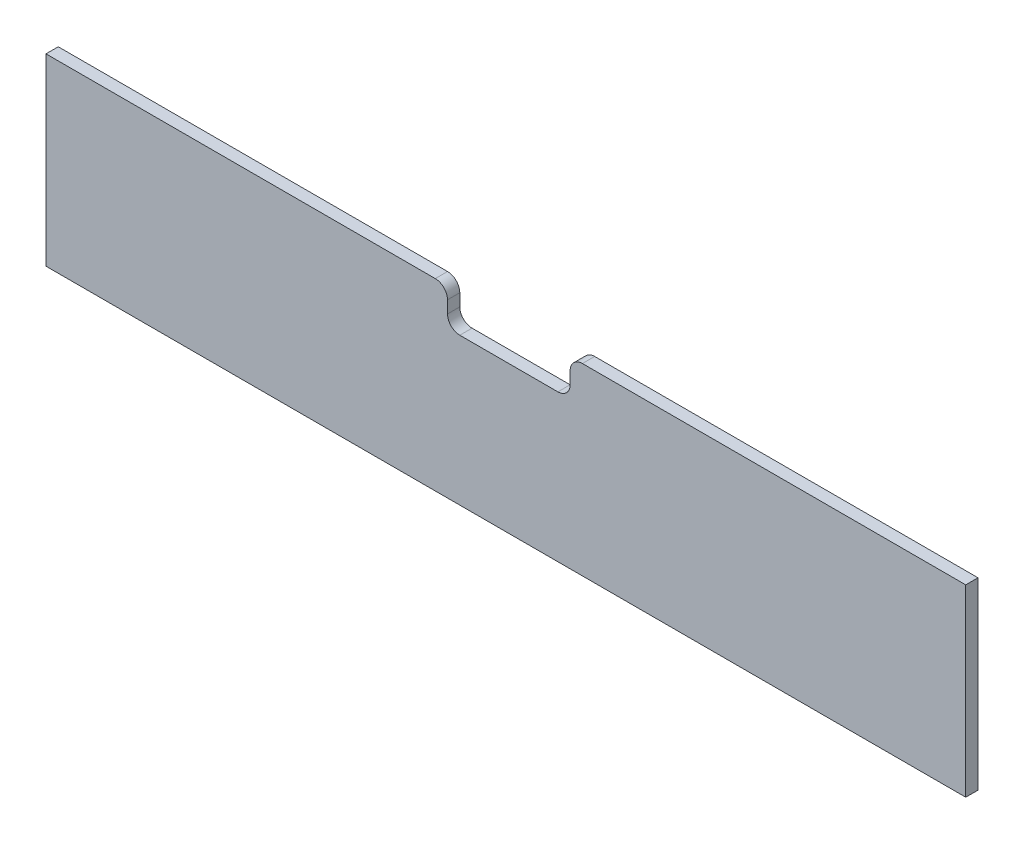
ISO-10303-21;
HEADER;
FILE_DESCRIPTION(('STEP AP214'),'2;1');
FILE_NAME('part.step','',(''),(''),'','','');
FILE_SCHEMA(('AUTOMOTIVE_DESIGN { 1 0 10303 214 1 1 1 1 }'));
ENDSEC;
DATA;
#1=APPLICATION_CONTEXT('core data for automotive mechanical design processes');
#2=APPLICATION_PROTOCOL_DEFINITION('international standard','automotive_design',2000,#1);
#3=PRODUCT_CONTEXT('',#1,'mechanical');
#4=PRODUCT('Part','Part','',(#3));
#5=PRODUCT_RELATED_PRODUCT_CATEGORY('part','',(#4));
#6=PRODUCT_DEFINITION_FORMATION('','',#4);
#7=PRODUCT_DEFINITION_CONTEXT('part definition',#1,'design');
#8=PRODUCT_DEFINITION('design','',#6,#7);
#9=PRODUCT_DEFINITION_SHAPE('','',#8);
#10=(LENGTH_UNIT() NAMED_UNIT(*) SI_UNIT(.MILLI.,.METRE.));
#11=(NAMED_UNIT(*) PLANE_ANGLE_UNIT() SI_UNIT($,.RADIAN.));
#12=(NAMED_UNIT(*) SI_UNIT($,.STERADIAN.) SOLID_ANGLE_UNIT());
#13=UNCERTAINTY_MEASURE_WITH_UNIT(LENGTH_MEASURE(1.E-05),#10,'distance_accuracy_value','');
#14=(GEOMETRIC_REPRESENTATION_CONTEXT(3) GLOBAL_UNCERTAINTY_ASSIGNED_CONTEXT((#13)) GLOBAL_UNIT_ASSIGNED_CONTEXT((#10,
#11,#12)) REPRESENTATION_CONTEXT('',''));
#15=CARTESIAN_POINT('',(0.,0.,0.));
#16=DIRECTION('',(0.,0.,1.));
#17=DIRECTION('',(1.,0.,0.));
#18=AXIS2_PLACEMENT_3D('',#15,#16,#17);
#19=CARTESIAN_POINT('',(-476.25,95.25,12.7));
#20=DIRECTION('',(0.,1.,0.));
#21=DIRECTION('',(0.,0.,1.));
#22=AXIS2_PLACEMENT_3D('',#19,#20,#21);
#23=PLANE('',#22);
#24=DIRECTION('',(1.,0.,0.));
#25=VECTOR('',#24,1.);
#26=CARTESIAN_POINT('',(-476.25,95.25,0.));
#27=LINE('',#26,#25);
#28=CARTESIAN_POINT('',(79.2787632550681,95.25,0.));
#29=VERTEX_POINT('',#28);
#30=CARTESIAN_POINT('',(476.25,95.25,0.));
#31=VERTEX_POINT('',#30);
#32=EDGE_CURVE('E162',#29,#31,#27,.T.);
#33=ORIENTED_EDGE('',*,*,#32,.F.);
#34=DIRECTION('',(0.,0.,1.));
#35=VECTOR('',#34,1.);
#36=CARTESIAN_POINT('',(79.2787632550681,95.25,12.7));
#37=LINE('',#36,#35);
#38=CARTESIAN_POINT('',(79.2787632550681,95.25,12.7));
#39=VERTEX_POINT('',#38);
#40=EDGE_CURVE('E183',#29,#39,#37,.T.);
#41=ORIENTED_EDGE('',*,*,#40,.T.);
#42=DIRECTION('',(1.,0.,0.));
#43=VECTOR('',#42,1.);
#44=CARTESIAN_POINT('',(-476.25,95.25,12.7));
#45=LINE('',#44,#43);
#46=CARTESIAN_POINT('',(476.25,95.25,12.7));
#47=VERTEX_POINT('',#46);
#48=EDGE_CURVE('E144',#39,#47,#45,.T.);
#49=ORIENTED_EDGE('',*,*,#48,.T.);
#50=DIRECTION('',(0.,0.,-1.));
#51=VECTOR('',#50,1.);
#52=CARTESIAN_POINT('',(476.25,95.25,12.7));
#53=LINE('',#52,#51);
#54=EDGE_CURVE('E133',#47,#31,#53,.T.);
#55=ORIENTED_EDGE('',*,*,#54,.T.);
#56=EDGE_LOOP('',(#33,#41,#49,#55));
#57=FACE_BOUND('',#56,.T.);
#58=ADVANCED_FACE('F33',(#57),#23,.T.);
#59=CARTESIAN_POINT('',(-476.25,-95.25,12.7));
#60=DIRECTION('',(-1.,0.,0.));
#61=DIRECTION('',(0.,0.,1.));
#62=AXIS2_PLACEMENT_3D('',#59,#60,#61);
#63=PLANE('',#62);
#64=DIRECTION('',(0.,1.,0.));
#65=VECTOR('',#64,1.);
#66=CARTESIAN_POINT('',(-476.25,-95.25,0.));
#67=LINE('',#66,#65);
#68=CARTESIAN_POINT('',(-476.25,-95.25,0.));
#69=VERTEX_POINT('',#68);
#70=CARTESIAN_POINT('',(-476.25,95.25,0.));
#71=VERTEX_POINT('',#70);
#72=EDGE_CURVE('E160',#69,#71,#67,.T.);
#73=ORIENTED_EDGE('',*,*,#72,.F.);
#74=DIRECTION('',(0.,0.,-1.));
#75=VECTOR('',#74,1.);
#76=CARTESIAN_POINT('',(-476.25,-95.25,12.7));
#77=LINE('',#76,#75);
#78=CARTESIAN_POINT('',(-476.25,-95.25,12.7));
#79=VERTEX_POINT('',#78);
#80=EDGE_CURVE('E147',#79,#69,#77,.T.);
#81=ORIENTED_EDGE('',*,*,#80,.F.);
#82=DIRECTION('',(0.,1.,0.));
#83=VECTOR('',#82,1.);
#84=CARTESIAN_POINT('',(-476.25,-95.25,12.7));
#85=LINE('',#84,#83);
#86=CARTESIAN_POINT('',(-476.25,95.25,12.7));
#87=VERTEX_POINT('',#86);
#88=EDGE_CURVE('E140',#79,#87,#85,.T.);
#89=ORIENTED_EDGE('',*,*,#88,.T.);
#90=DIRECTION('',(0.,0.,-1.));
#91=VECTOR('',#90,1.);
#92=CARTESIAN_POINT('',(-476.25,95.25,12.7));
#93=LINE('',#92,#91);
#94=EDGE_CURVE('E123',#87,#71,#93,.T.);
#95=ORIENTED_EDGE('',*,*,#94,.T.);
#96=EDGE_LOOP('',(#73,#81,#89,#95));
#97=FACE_BOUND('',#96,.T.);
#98=ADVANCED_FACE('F146',(#97),#63,.T.);
#99=CARTESIAN_POINT('',(-476.25,-95.25,12.7));
#100=DIRECTION('',(0.,1.,0.));
#101=DIRECTION('',(0.,0.,1.));
#102=AXIS2_PLACEMENT_3D('',#99,#100,#101);
#103=PLANE('',#102);
#104=DIRECTION('',(1.,0.,0.));
#105=VECTOR('',#104,1.);
#106=CARTESIAN_POINT('',(-476.25,-95.25,0.));
#107=LINE('',#106,#105);
#108=CARTESIAN_POINT('',(476.25,-95.25,0.));
#109=VERTEX_POINT('',#108);
#110=EDGE_CURVE('E149',#69,#109,#107,.T.);
#111=ORIENTED_EDGE('',*,*,#110,.T.);
#112=DIRECTION('',(0.,0.,-1.));
#113=VECTOR('',#112,1.);
#114=CARTESIAN_POINT('',(476.25,-95.25,12.7));
#115=LINE('',#114,#113);
#116=CARTESIAN_POINT('',(476.25,-95.25,12.7));
#117=VERTEX_POINT('',#116);
#118=EDGE_CURVE('E169',#117,#109,#115,.T.);
#119=ORIENTED_EDGE('',*,*,#118,.F.);
#120=DIRECTION('',(1.,0.,0.));
#121=VECTOR('',#120,1.);
#122=CARTESIAN_POINT('',(-476.25,-95.25,12.7));
#123=LINE('',#122,#121);
#124=EDGE_CURVE('E134',#79,#117,#123,.T.);
#125=ORIENTED_EDGE('',*,*,#124,.F.);
#126=ORIENTED_EDGE('',*,*,#80,.T.);
#127=EDGE_LOOP('',(#111,#119,#125,#126));
#128=FACE_BOUND('',#127,.T.);
#129=ADVANCED_FACE('F260',(#128),#103,.F.);
#130=CARTESIAN_POINT('',(476.25,-95.25,12.7));
#131=DIRECTION('',(-1.,0.,0.));
#132=DIRECTION('',(0.,0.,1.));
#133=AXIS2_PLACEMENT_3D('',#130,#131,#132);
#134=PLANE('',#133);
#135=DIRECTION('',(0.,1.,0.));
#136=VECTOR('',#135,1.);
#137=CARTESIAN_POINT('',(476.25,-95.25,0.));
#138=LINE('',#137,#136);
#139=EDGE_CURVE('E151',#109,#31,#138,.T.);
#140=ORIENTED_EDGE('',*,*,#139,.T.);
#141=ORIENTED_EDGE('',*,*,#54,.F.);
#142=DIRECTION('',(0.,1.,0.));
#143=VECTOR('',#142,1.);
#144=CARTESIAN_POINT('',(476.25,-95.25,12.7));
#145=LINE('',#144,#143);
#146=EDGE_CURVE('E143',#117,#47,#145,.T.);
#147=ORIENTED_EDGE('',*,*,#146,.F.);
#148=ORIENTED_EDGE('',*,*,#118,.T.);
#149=EDGE_LOOP('',(#140,#141,#147,#148));
#150=FACE_BOUND('',#149,.T.);
#151=ADVANCED_FACE('F256',(#150),#134,.F.);
#152=CARTESIAN_POINT('',(-73.121236744932,95.25,12.7));
#153=VERTEX_POINT('',#152);
#154=EDGE_CURVE('E126',#87,#153,#45,.T.);
#155=ORIENTED_EDGE('',*,*,#154,.T.);
#156=DIRECTION('',(0.,0.,1.));
#157=VECTOR('',#156,1.);
#158=CARTESIAN_POINT('',(-73.121236744932,95.25,0.));
#159=LINE('',#158,#157);
#160=CARTESIAN_POINT('',(-73.121236744932,95.25,0.));
#161=VERTEX_POINT('',#160);
#162=EDGE_CURVE('E196',#153,#161,#159,.F.);
#163=ORIENTED_EDGE('',*,*,#162,.T.);
#164=EDGE_CURVE('E128',#71,#161,#27,.T.);
#165=ORIENTED_EDGE('',*,*,#164,.F.);
#166=ORIENTED_EDGE('',*,*,#94,.F.);
#167=EDGE_LOOP('',(#155,#163,#165,#166));
#168=FACE_BOUND('',#167,.T.);
#169=ADVANCED_FACE('F125',(#168),#23,.T.);
#170=CARTESIAN_POINT('',(0.,0.,12.7));
#171=DIRECTION('',(0.,0.,-1.));
#172=DIRECTION('',(-1.,0.,0.));
#173=AXIS2_PLACEMENT_3D('',#170,#171,#172);
#174=PLANE('',#173);
#175=ORIENTED_EDGE('',*,*,#48,.F.);
#176=CARTESIAN_POINT('',(79.2787632550681,82.55,12.7));
#177=DIRECTION('',(0.,0.,-1.));
#178=DIRECTION('',(-1.,0.,0.));
#179=AXIS2_PLACEMENT_3D('',#176,#177,#178);
#180=CIRCLE('',#179,12.7);
#181=CARTESIAN_POINT('',(66.578763255068,82.55,12.7));
#182=VERTEX_POINT('',#181);
#183=EDGE_CURVE('E187',#39,#182,#180,.F.);
#184=ORIENTED_EDGE('',*,*,#183,.T.);
#185=DIRECTION('',(0.,1.,0.));
#186=VECTOR('',#185,1.);
#187=CARTESIAN_POINT('',(66.578763255068,57.15,12.7));
#188=LINE('',#187,#186);
#189=CARTESIAN_POINT('',(66.578763255068,69.85,12.7));
#190=VERTEX_POINT('',#189);
#191=EDGE_CURVE('E208',#190,#182,#188,.T.);
#192=ORIENTED_EDGE('',*,*,#191,.F.);
#193=CARTESIAN_POINT('',(53.878763255068,69.85,12.7));
#194=DIRECTION('',(0.,0.,-1.));
#195=DIRECTION('',(-1.,0.,0.));
#196=AXIS2_PLACEMENT_3D('',#193,#194,#195);
#197=CIRCLE('',#196,12.7);
#198=CARTESIAN_POINT('',(53.878763255068,57.15,12.7));
#199=VERTEX_POINT('',#198);
#200=EDGE_CURVE('E198',#190,#199,#197,.T.);
#201=ORIENTED_EDGE('',*,*,#200,.T.);
#202=DIRECTION('',(1.,0.,0.));
#203=VECTOR('',#202,1.);
#204=CARTESIAN_POINT('',(-60.421236744932,57.15,12.7));
#205=LINE('',#204,#203);
#206=CARTESIAN_POINT('',(-47.721236744932,57.15,12.7));
#207=VERTEX_POINT('',#206);
#208=EDGE_CURVE('E154',#207,#199,#205,.T.);
#209=ORIENTED_EDGE('',*,*,#208,.F.);
#210=CARTESIAN_POINT('',(-47.721236744932,69.85,12.7));
#211=DIRECTION('',(0.,0.,-1.));
#212=DIRECTION('',(-1.,0.,0.));
#213=AXIS2_PLACEMENT_3D('',#210,#211,#212);
#214=CIRCLE('',#213,12.7);
#215=CARTESIAN_POINT('',(-60.421236744932,69.85,12.7));
#216=VERTEX_POINT('',#215);
#217=EDGE_CURVE('E41',#207,#216,#214,.T.);
#218=ORIENTED_EDGE('',*,*,#217,.T.);
#219=DIRECTION('',(0.,-1.,0.));
#220=VECTOR('',#219,1.);
#221=CARTESIAN_POINT('',(-60.421236744932,57.15,12.7));
#222=LINE('',#221,#220);
#223=CARTESIAN_POINT('',(-60.421236744932,82.55,12.7));
#224=VERTEX_POINT('',#223);
#225=EDGE_CURVE('E202',#224,#216,#222,.T.);
#226=ORIENTED_EDGE('',*,*,#225,.F.);
#227=CARTESIAN_POINT('',(-73.121236744932,82.55,12.7));
#228=DIRECTION('',(0.,0.,-1.));
#229=DIRECTION('',(-1.,0.,0.));
#230=AXIS2_PLACEMENT_3D('',#227,#228,#229);
#231=CIRCLE('',#230,12.7);
#232=EDGE_CURVE('E142',#224,#153,#231,.F.);
#233=ORIENTED_EDGE('',*,*,#232,.T.);
#234=ORIENTED_EDGE('',*,*,#154,.F.);
#235=ORIENTED_EDGE('',*,*,#88,.F.);
#236=ORIENTED_EDGE('',*,*,#124,.T.);
#237=ORIENTED_EDGE('',*,*,#146,.T.);
#238=EDGE_LOOP('',(#175,#184,#192,#201,#209,#218,#226,#233,#234,#235,#236,#237));
#239=FACE_BOUND('',#238,.T.);
#240=ADVANCED_FACE('F139',(#239),#174,.F.);
#241=CARTESIAN_POINT('',(0.,0.,0.));
#242=DIRECTION('',(0.,0.,-1.));
#243=DIRECTION('',(-1.,0.,0.));
#244=AXIS2_PLACEMENT_3D('',#241,#242,#243);
#245=PLANE('',#244);
#246=CARTESIAN_POINT('',(-319.0875,-82.55,0.));
#247=DIRECTION('',(0.,0.,-1.));
#248=DIRECTION('',(-1.,0.,0.));
#249=AXIS2_PLACEMENT_3D('',#246,#247,#248);
#250=CIRCLE('',#249,3.17499999999997);
#251=CARTESIAN_POINT('',(-322.2625,-82.55,0.));
#252=VERTEX_POINT('',#251);
#253=EDGE_CURVE('E415',#252,#252,#250,.T.);
#254=ORIENTED_EDGE('',*,*,#253,.F.);
#255=EDGE_LOOP('',(#254));
#256=FACE_BOUND('',#255,.T.);
#257=CARTESIAN_POINT('',(-106.3625,-82.55,0.));
#258=DIRECTION('',(0.,0.,-1.));
#259=DIRECTION('',(-1.,0.,0.));
#260=AXIS2_PLACEMENT_3D('',#257,#258,#259);
#261=CIRCLE('',#260,3.17499999999997);
#262=CARTESIAN_POINT('',(-109.5375,-82.55,0.));
#263=VERTEX_POINT('',#262);
#264=EDGE_CURVE('E414',#263,#263,#261,.T.);
#265=ORIENTED_EDGE('',*,*,#264,.F.);
#266=EDGE_LOOP('',(#265));
#267=FACE_BOUND('',#266,.T.);
#268=CARTESIAN_POINT('',(106.3625,-82.55,0.));
#269=DIRECTION('',(0.,0.,-1.));
#270=DIRECTION('',(-1.,0.,0.));
#271=AXIS2_PLACEMENT_3D('',#268,#269,#270);
#272=CIRCLE('',#271,3.17499999999997);
#273=CARTESIAN_POINT('',(103.1875,-82.55,0.));
#274=VERTEX_POINT('',#273);
#275=EDGE_CURVE('E424',#274,#274,#272,.T.);
#276=ORIENTED_EDGE('',*,*,#275,.F.);
#277=EDGE_LOOP('',(#276));
#278=FACE_BOUND('',#277,.T.);
#279=CARTESIAN_POINT('',(319.0875,-82.55,0.));
#280=DIRECTION('',(0.,0.,-1.));
#281=DIRECTION('',(-1.,0.,0.));
#282=AXIS2_PLACEMENT_3D('',#279,#280,#281);
#283=CIRCLE('',#282,3.17499999999997);
#284=CARTESIAN_POINT('',(315.9125,-82.55,0.));
#285=VERTEX_POINT('',#284);
#286=EDGE_CURVE('E429',#285,#285,#283,.T.);
#287=ORIENTED_EDGE('',*,*,#286,.F.);
#288=EDGE_LOOP('',(#287));
#289=FACE_BOUND('',#288,.T.);
#290=CARTESIAN_POINT('',(-425.45,-82.55,0.));
#291=DIRECTION('',(0.,0.,-1.));
#292=DIRECTION('',(-1.,0.,0.));
#293=AXIS2_PLACEMENT_3D('',#290,#291,#292);
#294=CIRCLE('',#293,2.50000000000002);
#295=CARTESIAN_POINT('',(-427.95,-82.55,0.));
#296=VERTEX_POINT('',#295);
#297=EDGE_CURVE('E435',#296,#296,#294,.T.);
#298=ORIENTED_EDGE('',*,*,#297,.F.);
#299=EDGE_LOOP('',(#298));
#300=FACE_BOUND('',#299,.T.);
#301=CARTESIAN_POINT('',(-212.725,-82.55,0.));
#302=DIRECTION('',(0.,0.,-1.));
#303=DIRECTION('',(-1.,0.,0.));
#304=AXIS2_PLACEMENT_3D('',#301,#302,#303);
#305=CIRCLE('',#304,2.50000000000002);
#306=CARTESIAN_POINT('',(-215.225,-82.55,0.));
#307=VERTEX_POINT('',#306);
#308=EDGE_CURVE('E441',#307,#307,#305,.T.);
#309=ORIENTED_EDGE('',*,*,#308,.F.);
#310=EDGE_LOOP('',(#309));
#311=FACE_BOUND('',#310,.T.);
#312=CARTESIAN_POINT('',(0.,-82.55,0.));
#313=DIRECTION('',(0.,0.,-1.));
#314=DIRECTION('',(-1.,0.,0.));
#315=AXIS2_PLACEMENT_3D('',#312,#313,#314);
#316=CIRCLE('',#315,2.50000000000002);
#317=CARTESIAN_POINT('',(-2.50000000000008,-82.55,0.));
#318=VERTEX_POINT('',#317);
#319=EDGE_CURVE('E447',#318,#318,#316,.T.);
#320=ORIENTED_EDGE('',*,*,#319,.F.);
#321=EDGE_LOOP('',(#320));
#322=FACE_BOUND('',#321,.T.);
#323=CARTESIAN_POINT('',(212.725,-82.55,0.));
#324=DIRECTION('',(0.,0.,-1.));
#325=DIRECTION('',(-1.,0.,0.));
#326=AXIS2_PLACEMENT_3D('',#323,#324,#325);
#327=CIRCLE('',#326,2.50000000000002);
#328=CARTESIAN_POINT('',(210.225,-82.55,0.));
#329=VERTEX_POINT('',#328);
#330=EDGE_CURVE('E453',#329,#329,#327,.T.);
#331=ORIENTED_EDGE('',*,*,#330,.F.);
#332=EDGE_LOOP('',(#331));
#333=FACE_BOUND('',#332,.T.);
#334=CARTESIAN_POINT('',(425.45,-82.55,0.));
#335=DIRECTION('',(0.,0.,-1.));
#336=DIRECTION('',(-1.,0.,0.));
#337=AXIS2_PLACEMENT_3D('',#334,#335,#336);
#338=CIRCLE('',#337,2.50000000000002);
#339=CARTESIAN_POINT('',(422.95,-82.55,0.));
#340=VERTEX_POINT('',#339);
#341=EDGE_CURVE('E459',#340,#340,#338,.T.);
#342=ORIENTED_EDGE('',*,*,#341,.F.);
#343=EDGE_LOOP('',(#342));
#344=FACE_BOUND('',#343,.T.);
#345=CARTESIAN_POINT('',(-425.45,44.4500000000001,0.));
#346=DIRECTION('',(0.,0.,-1.));
#347=DIRECTION('',(1.,0.,0.));
#348=AXIS2_PLACEMENT_3D('',#345,#346,#347);
#349=CIRCLE('',#348,2.50000000000002);
#350=CARTESIAN_POINT('',(-422.95,44.4500000000001,0.));
#351=VERTEX_POINT('',#350);
#352=EDGE_CURVE('E465',#351,#351,#349,.T.);
#353=ORIENTED_EDGE('',*,*,#352,.F.);
#354=EDGE_LOOP('',(#353));
#355=FACE_BOUND('',#354,.T.);
#356=CARTESIAN_POINT('',(-425.45,-44.4500000000001,0.));
#357=DIRECTION('',(0.,0.,-1.));
#358=DIRECTION('',(-1.,0.,0.));
#359=AXIS2_PLACEMENT_3D('',#356,#357,#358);
#360=CIRCLE('',#359,2.50000000000008);
#361=CARTESIAN_POINT('',(-427.95,-44.4500000000001,0.));
#362=VERTEX_POINT('',#361);
#363=EDGE_CURVE('E471',#362,#362,#360,.T.);
#364=ORIENTED_EDGE('',*,*,#363,.F.);
#365=EDGE_LOOP('',(#364));
#366=FACE_BOUND('',#365,.T.);
#367=CARTESIAN_POINT('',(425.45,-44.45,0.));
#368=DIRECTION('',(0.,0.,-1.));
#369=DIRECTION('',(1.,0.,0.));
#370=AXIS2_PLACEMENT_3D('',#367,#368,#369);
#371=CIRCLE('',#370,2.50000000000002);
#372=CARTESIAN_POINT('',(427.95,-44.45,0.));
#373=VERTEX_POINT('',#372);
#374=EDGE_CURVE('E477',#373,#373,#371,.T.);
#375=ORIENTED_EDGE('',*,*,#374,.F.);
#376=EDGE_LOOP('',(#375));
#377=FACE_BOUND('',#376,.T.);
#378=CARTESIAN_POINT('',(425.45,44.45,0.));
#379=DIRECTION('',(0.,0.,-1.));
#380=DIRECTION('',(-1.,0.,0.));
#381=AXIS2_PLACEMENT_3D('',#378,#379,#380);
#382=CIRCLE('',#381,2.50000000000002);
#383=CARTESIAN_POINT('',(422.95,44.45,0.));
#384=VERTEX_POINT('',#383);
#385=EDGE_CURVE('E483',#384,#384,#382,.T.);
#386=ORIENTED_EDGE('',*,*,#385,.F.);
#387=EDGE_LOOP('',(#386));
#388=FACE_BOUND('',#387,.T.);
#389=CARTESIAN_POINT('',(-425.45,1.04950770296597E-13,0.));
#390=DIRECTION('',(0.,0.,-1.));
#391=DIRECTION('',(1.,0.,0.));
#392=AXIS2_PLACEMENT_3D('',#389,#390,#391);
#393=CIRCLE('',#392,3.17499999999997);
#394=CARTESIAN_POINT('',(-422.275,1.04950770296597E-13,0.));
#395=VERTEX_POINT('',#394);
#396=EDGE_CURVE('E239',#395,#395,#393,.T.);
#397=ORIENTED_EDGE('',*,*,#396,.F.);
#398=EDGE_LOOP('',(#397));
#399=FACE_BOUND('',#398,.T.);
#400=CARTESIAN_POINT('',(425.45,0.,0.));
#401=DIRECTION('',(0.,0.,-1.));
#402=DIRECTION('',(-1.,0.,0.));
#403=AXIS2_PLACEMENT_3D('',#400,#401,#402);
#404=CIRCLE('',#403,3.17499999999997);
#405=CARTESIAN_POINT('',(422.275,0.,0.));
#406=VERTEX_POINT('',#405);
#407=EDGE_CURVE('E231',#406,#406,#404,.T.);
#408=ORIENTED_EDGE('',*,*,#407,.F.);
#409=EDGE_LOOP('',(#408));
#410=FACE_BOUND('',#409,.T.);
#411=DIRECTION('',(0.,1.,0.));
#412=VECTOR('',#411,1.);
#413=CARTESIAN_POINT('',(66.578763255068,57.15,0.));
#414=LINE('',#413,#412);
#415=CARTESIAN_POINT('',(66.578763255068,69.85,0.));
#416=VERTEX_POINT('',#415);
#417=CARTESIAN_POINT('',(66.578763255068,82.55,0.));
#418=VERTEX_POINT('',#417);
#419=EDGE_CURVE('E221',#416,#418,#414,.T.);
#420=ORIENTED_EDGE('',*,*,#419,.T.);
#421=CARTESIAN_POINT('',(79.2787632550681,82.55,0.));
#422=DIRECTION('',(0.,0.,-1.));
#423=DIRECTION('',(-1.,0.,0.));
#424=AXIS2_PLACEMENT_3D('',#421,#422,#423);
#425=CIRCLE('',#424,12.7);
#426=EDGE_CURVE('E190',#418,#29,#425,.T.);
#427=ORIENTED_EDGE('',*,*,#426,.T.);
#428=ORIENTED_EDGE('',*,*,#32,.T.);
#429=ORIENTED_EDGE('',*,*,#139,.F.);
#430=ORIENTED_EDGE('',*,*,#110,.F.);
#431=ORIENTED_EDGE('',*,*,#72,.T.);
#432=ORIENTED_EDGE('',*,*,#164,.T.);
#433=CARTESIAN_POINT('',(-73.121236744932,82.55,0.));
#434=DIRECTION('',(0.,0.,-1.));
#435=DIRECTION('',(-1.,0.,0.));
#436=AXIS2_PLACEMENT_3D('',#433,#434,#435);
#437=CIRCLE('',#436,12.7);
#438=CARTESIAN_POINT('',(-60.421236744932,82.55,0.));
#439=VERTEX_POINT('',#438);
#440=EDGE_CURVE('E55',#161,#439,#437,.T.);
#441=ORIENTED_EDGE('',*,*,#440,.T.);
#442=DIRECTION('',(0.,-1.,0.));
#443=VECTOR('',#442,1.);
#444=CARTESIAN_POINT('',(-60.421236744932,57.15,0.));
#445=LINE('',#444,#443);
#446=CARTESIAN_POINT('',(-60.421236744932,69.85,0.));
#447=VERTEX_POINT('',#446);
#448=EDGE_CURVE('E216',#439,#447,#445,.T.);
#449=ORIENTED_EDGE('',*,*,#448,.T.);
#450=CARTESIAN_POINT('',(-47.721236744932,69.85,0.));
#451=DIRECTION('',(0.,0.,-1.));
#452=DIRECTION('',(-1.,0.,0.));
#453=AXIS2_PLACEMENT_3D('',#450,#451,#452);
#454=CIRCLE('',#453,12.7);
#455=CARTESIAN_POINT('',(-47.721236744932,57.15,0.));
#456=VERTEX_POINT('',#455);
#457=EDGE_CURVE('E11',#447,#456,#454,.F.);
#458=ORIENTED_EDGE('',*,*,#457,.T.);
#459=DIRECTION('',(1.,0.,0.));
#460=VECTOR('',#459,1.);
#461=CARTESIAN_POINT('',(-60.421236744932,57.15,0.));
#462=LINE('',#461,#460);
#463=CARTESIAN_POINT('',(53.878763255068,57.15,0.));
#464=VERTEX_POINT('',#463);
#465=EDGE_CURVE('E163',#456,#464,#462,.T.);
#466=ORIENTED_EDGE('',*,*,#465,.T.);
#467=CARTESIAN_POINT('',(53.878763255068,69.85,0.));
#468=DIRECTION('',(0.,0.,-1.));
#469=DIRECTION('',(-1.,0.,0.));
#470=AXIS2_PLACEMENT_3D('',#467,#468,#469);
#471=CIRCLE('',#470,12.7);
#472=EDGE_CURVE('E200',#464,#416,#471,.F.);
#473=ORIENTED_EDGE('',*,*,#472,.T.);
#474=EDGE_LOOP('',(#420,#427,#428,#429,#430,#431,#432,#441,#449,#458,#466,#473));
#475=FACE_BOUND('',#474,.T.);
#476=ADVANCED_FACE('F214',(#256,#267,#278,#289,#300,#311,#322,#333,#344,#355,#366,#377,#388,
#399,#410,#475),#245,.T.);
#477=CARTESIAN_POINT('',(66.578763255068,57.15,0.));
#478=DIRECTION('',(1.,0.,0.));
#479=DIRECTION('',(0.,0.,-1.));
#480=AXIS2_PLACEMENT_3D('',#477,#478,#479);
#481=PLANE('',#480);
#482=ORIENTED_EDGE('',*,*,#419,.F.);
#483=DIRECTION('',(0.,0.,1.));
#484=VECTOR('',#483,1.);
#485=CARTESIAN_POINT('',(66.578763255068,69.85,12.7));
#486=LINE('',#485,#484);
#487=EDGE_CURVE('E175',#416,#190,#486,.T.);
#488=ORIENTED_EDGE('',*,*,#487,.T.);
#489=ORIENTED_EDGE('',*,*,#191,.T.);
#490=DIRECTION('',(0.,0.,1.));
#491=VECTOR('',#490,1.);
#492=CARTESIAN_POINT('',(66.578763255068,82.55,0.));
#493=LINE('',#492,#491);
#494=EDGE_CURVE('E168',#182,#418,#493,.F.);
#495=ORIENTED_EDGE('',*,*,#494,.T.);
#496=EDGE_LOOP('',(#482,#488,#489,#495));
#497=FACE_BOUND('',#496,.T.);
#498=ADVANCED_FACE('F246',(#497),#481,.F.);
#499=CARTESIAN_POINT('',(-60.421236744932,57.15,0.));
#500=DIRECTION('',(0.,-1.,0.));
#501=DIRECTION('',(0.,0.,-1.));
#502=AXIS2_PLACEMENT_3D('',#499,#500,#501);
#503=PLANE('',#502);
#504=ORIENTED_EDGE('',*,*,#208,.T.);
#505=DIRECTION('',(0.,0.,1.));
#506=VECTOR('',#505,1.);
#507=CARTESIAN_POINT('',(53.878763255068,57.15,0.));
#508=LINE('',#507,#506);
#509=EDGE_CURVE('E181',#199,#464,#508,.F.);
#510=ORIENTED_EDGE('',*,*,#509,.T.);
#511=ORIENTED_EDGE('',*,*,#465,.F.);
#512=DIRECTION('',(0.,0.,1.));
#513=VECTOR('',#512,1.);
#514=CARTESIAN_POINT('',(-47.721236744932,57.15,12.7));
#515=LINE('',#514,#513);
#516=EDGE_CURVE('E178',#456,#207,#515,.T.);
#517=ORIENTED_EDGE('',*,*,#516,.T.);
#518=EDGE_LOOP('',(#504,#510,#511,#517));
#519=FACE_BOUND('',#518,.T.);
#520=ADVANCED_FACE('F218',(#519),#503,.F.);
#521=CARTESIAN_POINT('',(-60.421236744932,57.15,0.));
#522=DIRECTION('',(-1.,0.,0.));
#523=DIRECTION('',(0.,0.,1.));
#524=AXIS2_PLACEMENT_3D('',#521,#522,#523);
#525=PLANE('',#524);
#526=ORIENTED_EDGE('',*,*,#225,.T.);
#527=DIRECTION('',(0.,0.,1.));
#528=VECTOR('',#527,1.);
#529=CARTESIAN_POINT('',(-60.421236744932,69.85,0.));
#530=LINE('',#529,#528);
#531=EDGE_CURVE('E48',#216,#447,#530,.F.);
#532=ORIENTED_EDGE('',*,*,#531,.T.);
#533=ORIENTED_EDGE('',*,*,#448,.F.);
#534=DIRECTION('',(0.,0.,1.));
#535=VECTOR('',#534,1.);
#536=CARTESIAN_POINT('',(-60.421236744932,82.55,12.7));
#537=LINE('',#536,#535);
#538=EDGE_CURVE('E192',#439,#224,#537,.T.);
#539=ORIENTED_EDGE('',*,*,#538,.T.);
#540=EDGE_LOOP('',(#526,#532,#533,#539));
#541=FACE_BOUND('',#540,.T.);
#542=ADVANCED_FACE('F206',(#541),#525,.F.);
#543=CARTESIAN_POINT('',(53.878763255068,69.85,0.));
#544=DIRECTION('',(0.,0.,-1.));
#545=DIRECTION('',(-1.,0.,0.));
#546=AXIS2_PLACEMENT_3D('',#543,#544,#545);
#547=CYLINDRICAL_SURFACE('',#546,12.7);
#548=ORIENTED_EDGE('',*,*,#472,.F.);
#549=ORIENTED_EDGE('',*,*,#509,.F.);
#550=ORIENTED_EDGE('',*,*,#200,.F.);
#551=ORIENTED_EDGE('',*,*,#487,.F.);
#552=EDGE_LOOP('',(#548,#549,#550,#551));
#553=FACE_BOUND('',#552,.T.);
#554=ADVANCED_FACE('F244',(#553),#547,.F.);
#555=CARTESIAN_POINT('',(79.2787632550681,82.55,12.7));
#556=DIRECTION('',(0.,0.,-1.));
#557=DIRECTION('',(-1.,0.,0.));
#558=AXIS2_PLACEMENT_3D('',#555,#556,#557);
#559=CYLINDRICAL_SURFACE('',#558,12.7);
#560=ORIENTED_EDGE('',*,*,#426,.F.);
#561=ORIENTED_EDGE('',*,*,#494,.F.);
#562=ORIENTED_EDGE('',*,*,#183,.F.);
#563=ORIENTED_EDGE('',*,*,#40,.F.);
#564=EDGE_LOOP('',(#560,#561,#562,#563));
#565=FACE_BOUND('',#564,.T.);
#566=ADVANCED_FACE('F248',(#565),#559,.T.);
#567=CARTESIAN_POINT('',(-47.721236744932,69.85,0.));
#568=DIRECTION('',(0.,0.,-1.));
#569=DIRECTION('',(-1.,0.,0.));
#570=AXIS2_PLACEMENT_3D('',#567,#568,#569);
#571=CYLINDRICAL_SURFACE('',#570,12.7);
#572=ORIENTED_EDGE('',*,*,#457,.F.);
#573=ORIENTED_EDGE('',*,*,#531,.F.);
#574=ORIENTED_EDGE('',*,*,#217,.F.);
#575=ORIENTED_EDGE('',*,*,#516,.F.);
#576=EDGE_LOOP('',(#572,#573,#574,#575));
#577=FACE_BOUND('',#576,.T.);
#578=ADVANCED_FACE('F210',(#577),#571,.F.);
#579=CARTESIAN_POINT('',(-73.121236744932,82.55,0.));
#580=DIRECTION('',(0.,0.,-1.));
#581=DIRECTION('',(-1.,0.,0.));
#582=AXIS2_PLACEMENT_3D('',#579,#580,#581);
#583=CYLINDRICAL_SURFACE('',#582,12.7);
#584=ORIENTED_EDGE('',*,*,#440,.F.);
#585=ORIENTED_EDGE('',*,*,#162,.F.);
#586=ORIENTED_EDGE('',*,*,#232,.F.);
#587=ORIENTED_EDGE('',*,*,#538,.F.);
#588=EDGE_LOOP('',(#584,#585,#586,#587));
#589=FACE_BOUND('',#588,.T.);
#590=ADVANCED_FACE('F35',(#589),#583,.T.);
#591=CARTESIAN_POINT('',(425.45,0.,11.43));
#592=DIRECTION('',(0.,0.,-1.));
#593=DIRECTION('',(-1.,0.,0.));
#594=AXIS2_PLACEMENT_3D('',#591,#592,#593);
#595=CYLINDRICAL_SURFACE('',#594,3.17499999999997);
#596=CARTESIAN_POINT('',(425.45,0.,11.43));
#597=DIRECTION('',(0.,0.,-1.));
#598=DIRECTION('',(-1.,0.,0.));
#599=AXIS2_PLACEMENT_3D('',#596,#597,#598);
#600=CIRCLE('',#599,3.17499999999997);
#601=CARTESIAN_POINT('',(422.275,0.,11.43));
#602=VERTEX_POINT('',#601);
#603=EDGE_CURVE('E226',#602,#602,#600,.T.);
#604=ORIENTED_EDGE('',*,*,#603,.F.);
#605=EDGE_LOOP('',(#604));
#606=FACE_BOUND('',#605,.T.);
#607=ORIENTED_EDGE('',*,*,#407,.T.);
#608=EDGE_LOOP('',(#607));
#609=FACE_BOUND('',#608,.T.);
#610=ADVANCED_FACE('F291',(#606,#609),#595,.F.);
#611=CARTESIAN_POINT('',(425.45,0.,11.43));
#612=DIRECTION('',(0.,0.,-1.));
#613=DIRECTION('',(-1.,0.,0.));
#614=AXIS2_PLACEMENT_3D('',#611,#612,#613);
#615=PLANE('',#614);
#616=ORIENTED_EDGE('',*,*,#603,.T.);
#617=EDGE_LOOP('',(#616));
#618=FACE_BOUND('',#617,.T.);
#619=ADVANCED_FACE('F294',(#618),#615,.T.);
#620=CARTESIAN_POINT('',(-425.45,1.04950770296597E-13,11.43));
#621=DIRECTION('',(0.,0.,-1.));
#622=DIRECTION('',(-1.,0.,0.));
#623=AXIS2_PLACEMENT_3D('',#620,#621,#622);
#624=CYLINDRICAL_SURFACE('',#623,3.17499999999997);
#625=CARTESIAN_POINT('',(-425.45,1.04950770296597E-13,11.43));
#626=DIRECTION('',(0.,0.,-1.));
#627=DIRECTION('',(1.,0.,0.));
#628=AXIS2_PLACEMENT_3D('',#625,#626,#627);
#629=CIRCLE('',#628,3.17499999999997);
#630=CARTESIAN_POINT('',(-422.275,1.04950770296597E-13,11.43));
#631=VERTEX_POINT('',#630);
#632=EDGE_CURVE('E236',#631,#631,#629,.T.);
#633=ORIENTED_EDGE('',*,*,#632,.F.);
#634=EDGE_LOOP('',(#633));
#635=FACE_BOUND('',#634,.T.);
#636=ORIENTED_EDGE('',*,*,#396,.T.);
#637=EDGE_LOOP('',(#636));
#638=FACE_BOUND('',#637,.T.);
#639=ADVANCED_FACE('F298',(#635,#638),#624,.F.);
#640=CARTESIAN_POINT('',(-425.45,1.04950770296597E-13,11.43));
#641=DIRECTION('',(0.,0.,1.));
#642=DIRECTION('',(1.,0.,0.));
#643=AXIS2_PLACEMENT_3D('',#640,#641,#642);
#644=PLANE('',#643);
#645=ORIENTED_EDGE('',*,*,#632,.T.);
#646=EDGE_LOOP('',(#645));
#647=FACE_BOUND('',#646,.T.);
#648=ADVANCED_FACE('F301',(#647),#644,.F.);
#649=CARTESIAN_POINT('',(425.45,44.45,8.));
#650=DIRECTION('',(0.,0.,-1.));
#651=DIRECTION('',(-1.,0.,0.));
#652=AXIS2_PLACEMENT_3D('',#649,#650,#651);
#653=CYLINDRICAL_SURFACE('',#652,2.50000000000002);
#654=CARTESIAN_POINT('',(425.45,44.45,8.));
#655=DIRECTION('',(0.,0.,-1.));
#656=DIRECTION('',(-1.,0.,0.));
#657=AXIS2_PLACEMENT_3D('',#654,#655,#656);
#658=CIRCLE('',#657,2.50000000000002);
#659=CARTESIAN_POINT('',(422.95,44.45,8.));
#660=VERTEX_POINT('',#659);
#661=EDGE_CURVE('E486',#660,#660,#658,.T.);
#662=ORIENTED_EDGE('',*,*,#661,.F.);
#663=EDGE_LOOP('',(#662));
#664=FACE_BOUND('',#663,.T.);
#665=ORIENTED_EDGE('',*,*,#385,.T.);
#666=EDGE_LOOP('',(#665));
#667=FACE_BOUND('',#666,.T.);
#668=ADVANCED_FACE('F305',(#664,#667),#653,.F.);
#669=CARTESIAN_POINT('',(425.45,44.45,8.));
#670=DIRECTION('',(0.,0.,-1.));
#671=DIRECTION('',(-1.,0.,0.));
#672=AXIS2_PLACEMENT_3D('',#669,#670,#671);
#673=PLANE('',#672);
#674=ORIENTED_EDGE('',*,*,#661,.T.);
#675=EDGE_LOOP('',(#674));
#676=FACE_BOUND('',#675,.T.);
#677=ADVANCED_FACE('F309',(#676),#673,.T.);
#678=CARTESIAN_POINT('',(425.45,-44.45,8.));
#679=DIRECTION('',(0.,0.,-1.));
#680=DIRECTION('',(-1.,0.,0.));
#681=AXIS2_PLACEMENT_3D('',#678,#679,#680);
#682=CYLINDRICAL_SURFACE('',#681,2.50000000000002);
#683=CARTESIAN_POINT('',(425.45,-44.45,8.));
#684=DIRECTION('',(0.,0.,-1.));
#685=DIRECTION('',(1.,0.,0.));
#686=AXIS2_PLACEMENT_3D('',#683,#684,#685);
#687=CIRCLE('',#686,2.50000000000002);
#688=CARTESIAN_POINT('',(427.95,-44.45,8.));
#689=VERTEX_POINT('',#688);
#690=EDGE_CURVE('E480',#689,#689,#687,.T.);
#691=ORIENTED_EDGE('',*,*,#690,.F.);
#692=EDGE_LOOP('',(#691));
#693=FACE_BOUND('',#692,.T.);
#694=ORIENTED_EDGE('',*,*,#374,.T.);
#695=EDGE_LOOP('',(#694));
#696=FACE_BOUND('',#695,.T.);
#697=ADVANCED_FACE('F313',(#693,#696),#682,.F.);
#698=CARTESIAN_POINT('',(425.45,-44.45,8.));
#699=DIRECTION('',(0.,0.,1.));
#700=DIRECTION('',(1.,0.,0.));
#701=AXIS2_PLACEMENT_3D('',#698,#699,#700);
#702=PLANE('',#701);
#703=ORIENTED_EDGE('',*,*,#690,.T.);
#704=EDGE_LOOP('',(#703));
#705=FACE_BOUND('',#704,.T.);
#706=ADVANCED_FACE('F317',(#705),#702,.F.);
#707=CARTESIAN_POINT('',(-425.45,-44.4500000000001,8.));
#708=DIRECTION('',(0.,0.,-1.));
#709=DIRECTION('',(-1.,0.,0.));
#710=AXIS2_PLACEMENT_3D('',#707,#708,#709);
#711=CYLINDRICAL_SURFACE('',#710,2.50000000000008);
#712=CARTESIAN_POINT('',(-425.45,-44.4500000000001,8.));
#713=DIRECTION('',(0.,0.,-1.));
#714=DIRECTION('',(-1.,0.,0.));
#715=AXIS2_PLACEMENT_3D('',#712,#713,#714);
#716=CIRCLE('',#715,2.50000000000008);
#717=CARTESIAN_POINT('',(-427.95,-44.4500000000001,8.));
#718=VERTEX_POINT('',#717);
#719=EDGE_CURVE('E474',#718,#718,#716,.T.);
#720=ORIENTED_EDGE('',*,*,#719,.F.);
#721=EDGE_LOOP('',(#720));
#722=FACE_BOUND('',#721,.T.);
#723=ORIENTED_EDGE('',*,*,#363,.T.);
#724=EDGE_LOOP('',(#723));
#725=FACE_BOUND('',#724,.T.);
#726=ADVANCED_FACE('F321',(#722,#725),#711,.F.);
#727=CARTESIAN_POINT('',(-425.45,-44.4500000000001,8.));
#728=DIRECTION('',(0.,0.,-1.));
#729=DIRECTION('',(-1.,0.,0.));
#730=AXIS2_PLACEMENT_3D('',#727,#728,#729);
#731=PLANE('',#730);
#732=ORIENTED_EDGE('',*,*,#719,.T.);
#733=EDGE_LOOP('',(#732));
#734=FACE_BOUND('',#733,.T.);
#735=ADVANCED_FACE('F325',(#734),#731,.T.);
#736=CARTESIAN_POINT('',(-425.45,44.4500000000001,8.));
#737=DIRECTION('',(0.,0.,-1.));
#738=DIRECTION('',(-1.,0.,0.));
#739=AXIS2_PLACEMENT_3D('',#736,#737,#738);
#740=CYLINDRICAL_SURFACE('',#739,2.50000000000002);
#741=CARTESIAN_POINT('',(-425.45,44.4500000000001,8.));
#742=DIRECTION('',(0.,0.,-1.));
#743=DIRECTION('',(1.,0.,0.));
#744=AXIS2_PLACEMENT_3D('',#741,#742,#743);
#745=CIRCLE('',#744,2.50000000000002);
#746=CARTESIAN_POINT('',(-422.95,44.4500000000001,8.));
#747=VERTEX_POINT('',#746);
#748=EDGE_CURVE('E468',#747,#747,#745,.T.);
#749=ORIENTED_EDGE('',*,*,#748,.F.);
#750=EDGE_LOOP('',(#749));
#751=FACE_BOUND('',#750,.T.);
#752=ORIENTED_EDGE('',*,*,#352,.T.);
#753=EDGE_LOOP('',(#752));
#754=FACE_BOUND('',#753,.T.);
#755=ADVANCED_FACE('F329',(#751,#754),#740,.F.);
#756=CARTESIAN_POINT('',(-425.45,44.4500000000001,8.));
#757=DIRECTION('',(0.,0.,1.));
#758=DIRECTION('',(1.,0.,0.));
#759=AXIS2_PLACEMENT_3D('',#756,#757,#758);
#760=PLANE('',#759);
#761=ORIENTED_EDGE('',*,*,#748,.T.);
#762=EDGE_LOOP('',(#761));
#763=FACE_BOUND('',#762,.T.);
#764=ADVANCED_FACE('F333',(#763),#760,.F.);
#765=CARTESIAN_POINT('',(425.45,-82.55,8.));
#766=DIRECTION('',(0.,0.,-1.));
#767=DIRECTION('',(-1.,0.,0.));
#768=AXIS2_PLACEMENT_3D('',#765,#766,#767);
#769=CYLINDRICAL_SURFACE('',#768,2.50000000000002);
#770=CARTESIAN_POINT('',(425.45,-82.55,8.));
#771=DIRECTION('',(0.,0.,-1.));
#772=DIRECTION('',(-1.,0.,0.));
#773=AXIS2_PLACEMENT_3D('',#770,#771,#772);
#774=CIRCLE('',#773,2.50000000000002);
#775=CARTESIAN_POINT('',(422.95,-82.55,8.));
#776=VERTEX_POINT('',#775);
#777=EDGE_CURVE('E462',#776,#776,#774,.T.);
#778=ORIENTED_EDGE('',*,*,#777,.F.);
#779=EDGE_LOOP('',(#778));
#780=FACE_BOUND('',#779,.T.);
#781=ORIENTED_EDGE('',*,*,#341,.T.);
#782=EDGE_LOOP('',(#781));
#783=FACE_BOUND('',#782,.T.);
#784=ADVANCED_FACE('F337',(#780,#783),#769,.F.);
#785=CARTESIAN_POINT('',(425.45,-82.55,8.));
#786=DIRECTION('',(0.,0.,-1.));
#787=DIRECTION('',(-1.,0.,0.));
#788=AXIS2_PLACEMENT_3D('',#785,#786,#787);
#789=PLANE('',#788);
#790=ORIENTED_EDGE('',*,*,#777,.T.);
#791=EDGE_LOOP('',(#790));
#792=FACE_BOUND('',#791,.T.);
#793=ADVANCED_FACE('F341',(#792),#789,.T.);
#794=CARTESIAN_POINT('',(212.725,-82.55,8.));
#795=DIRECTION('',(0.,0.,-1.));
#796=DIRECTION('',(-1.,0.,0.));
#797=AXIS2_PLACEMENT_3D('',#794,#795,#796);
#798=CYLINDRICAL_SURFACE('',#797,2.50000000000002);
#799=CARTESIAN_POINT('',(212.725,-82.55,8.));
#800=DIRECTION('',(0.,0.,-1.));
#801=DIRECTION('',(-1.,0.,0.));
#802=AXIS2_PLACEMENT_3D('',#799,#800,#801);
#803=CIRCLE('',#802,2.50000000000002);
#804=CARTESIAN_POINT('',(210.225,-82.55,8.));
#805=VERTEX_POINT('',#804);
#806=EDGE_CURVE('E456',#805,#805,#803,.T.);
#807=ORIENTED_EDGE('',*,*,#806,.F.);
#808=EDGE_LOOP('',(#807));
#809=FACE_BOUND('',#808,.T.);
#810=ORIENTED_EDGE('',*,*,#330,.T.);
#811=EDGE_LOOP('',(#810));
#812=FACE_BOUND('',#811,.T.);
#813=ADVANCED_FACE('F345',(#809,#812),#798,.F.);
#814=CARTESIAN_POINT('',(212.725,-82.55,8.));
#815=DIRECTION('',(0.,0.,-1.));
#816=DIRECTION('',(-1.,0.,0.));
#817=AXIS2_PLACEMENT_3D('',#814,#815,#816);
#818=PLANE('',#817);
#819=ORIENTED_EDGE('',*,*,#806,.T.);
#820=EDGE_LOOP('',(#819));
#821=FACE_BOUND('',#820,.T.);
#822=ADVANCED_FACE('F349',(#821),#818,.T.);
#823=CARTESIAN_POINT('',(0.,-82.55,8.));
#824=DIRECTION('',(0.,0.,-1.));
#825=DIRECTION('',(-1.,0.,0.));
#826=AXIS2_PLACEMENT_3D('',#823,#824,#825);
#827=CYLINDRICAL_SURFACE('',#826,2.50000000000002);
#828=CARTESIAN_POINT('',(0.,-82.55,8.));
#829=DIRECTION('',(0.,0.,-1.));
#830=DIRECTION('',(-1.,0.,0.));
#831=AXIS2_PLACEMENT_3D('',#828,#829,#830);
#832=CIRCLE('',#831,2.50000000000002);
#833=CARTESIAN_POINT('',(-2.50000000000008,-82.55,8.));
#834=VERTEX_POINT('',#833);
#835=EDGE_CURVE('E450',#834,#834,#832,.T.);
#836=ORIENTED_EDGE('',*,*,#835,.F.);
#837=EDGE_LOOP('',(#836));
#838=FACE_BOUND('',#837,.T.);
#839=ORIENTED_EDGE('',*,*,#319,.T.);
#840=EDGE_LOOP('',(#839));
#841=FACE_BOUND('',#840,.T.);
#842=ADVANCED_FACE('F353',(#838,#841),#827,.F.);
#843=CARTESIAN_POINT('',(0.,-82.55,8.));
#844=DIRECTION('',(0.,0.,-1.));
#845=DIRECTION('',(-1.,0.,0.));
#846=AXIS2_PLACEMENT_3D('',#843,#844,#845);
#847=PLANE('',#846);
#848=ORIENTED_EDGE('',*,*,#835,.T.);
#849=EDGE_LOOP('',(#848));
#850=FACE_BOUND('',#849,.T.);
#851=ADVANCED_FACE('F357',(#850),#847,.T.);
#852=CARTESIAN_POINT('',(-212.725,-82.55,8.));
#853=DIRECTION('',(0.,0.,-1.));
#854=DIRECTION('',(-1.,0.,0.));
#855=AXIS2_PLACEMENT_3D('',#852,#853,#854);
#856=CYLINDRICAL_SURFACE('',#855,2.50000000000002);
#857=CARTESIAN_POINT('',(-212.725,-82.55,8.));
#858=DIRECTION('',(0.,0.,-1.));
#859=DIRECTION('',(-1.,0.,0.));
#860=AXIS2_PLACEMENT_3D('',#857,#858,#859);
#861=CIRCLE('',#860,2.50000000000002);
#862=CARTESIAN_POINT('',(-215.225,-82.55,8.));
#863=VERTEX_POINT('',#862);
#864=EDGE_CURVE('E444',#863,#863,#861,.T.);
#865=ORIENTED_EDGE('',*,*,#864,.F.);
#866=EDGE_LOOP('',(#865));
#867=FACE_BOUND('',#866,.T.);
#868=ORIENTED_EDGE('',*,*,#308,.T.);
#869=EDGE_LOOP('',(#868));
#870=FACE_BOUND('',#869,.T.);
#871=ADVANCED_FACE('F361',(#867,#870),#856,.F.);
#872=CARTESIAN_POINT('',(-212.725,-82.55,8.));
#873=DIRECTION('',(0.,0.,-1.));
#874=DIRECTION('',(-1.,0.,0.));
#875=AXIS2_PLACEMENT_3D('',#872,#873,#874);
#876=PLANE('',#875);
#877=ORIENTED_EDGE('',*,*,#864,.T.);
#878=EDGE_LOOP('',(#877));
#879=FACE_BOUND('',#878,.T.);
#880=ADVANCED_FACE('F365',(#879),#876,.T.);
#881=CARTESIAN_POINT('',(-425.45,-82.55,8.));
#882=DIRECTION('',(0.,0.,-1.));
#883=DIRECTION('',(-1.,0.,0.));
#884=AXIS2_PLACEMENT_3D('',#881,#882,#883);
#885=CYLINDRICAL_SURFACE('',#884,2.50000000000002);
#886=CARTESIAN_POINT('',(-425.45,-82.55,8.));
#887=DIRECTION('',(0.,0.,-1.));
#888=DIRECTION('',(-1.,0.,0.));
#889=AXIS2_PLACEMENT_3D('',#886,#887,#888);
#890=CIRCLE('',#889,2.50000000000002);
#891=CARTESIAN_POINT('',(-427.95,-82.55,8.));
#892=VERTEX_POINT('',#891);
#893=EDGE_CURVE('E438',#892,#892,#890,.T.);
#894=ORIENTED_EDGE('',*,*,#893,.F.);
#895=EDGE_LOOP('',(#894));
#896=FACE_BOUND('',#895,.T.);
#897=ORIENTED_EDGE('',*,*,#297,.T.);
#898=EDGE_LOOP('',(#897));
#899=FACE_BOUND('',#898,.T.);
#900=ADVANCED_FACE('F369',(#896,#899),#885,.F.);
#901=CARTESIAN_POINT('',(-425.45,-82.55,8.));
#902=DIRECTION('',(0.,0.,-1.));
#903=DIRECTION('',(-1.,0.,0.));
#904=AXIS2_PLACEMENT_3D('',#901,#902,#903);
#905=PLANE('',#904);
#906=ORIENTED_EDGE('',*,*,#893,.T.);
#907=EDGE_LOOP('',(#906));
#908=FACE_BOUND('',#907,.T.);
#909=ADVANCED_FACE('F373',(#908),#905,.T.);
#910=CARTESIAN_POINT('',(319.0875,-82.55,11.43));
#911=DIRECTION('',(0.,0.,-1.));
#912=DIRECTION('',(-1.,0.,0.));
#913=AXIS2_PLACEMENT_3D('',#910,#911,#912);
#914=CYLINDRICAL_SURFACE('',#913,3.17499999999997);
#915=CARTESIAN_POINT('',(319.0875,-82.55,11.43));
#916=DIRECTION('',(0.,0.,-1.));
#917=DIRECTION('',(-1.,0.,0.));
#918=AXIS2_PLACEMENT_3D('',#915,#916,#917);
#919=CIRCLE('',#918,3.17499999999997);
#920=CARTESIAN_POINT('',(315.9125,-82.55,11.43));
#921=VERTEX_POINT('',#920);
#922=EDGE_CURVE('E432',#921,#921,#919,.T.);
#923=ORIENTED_EDGE('',*,*,#922,.F.);
#924=EDGE_LOOP('',(#923));
#925=FACE_BOUND('',#924,.T.);
#926=ORIENTED_EDGE('',*,*,#286,.T.);
#927=EDGE_LOOP('',(#926));
#928=FACE_BOUND('',#927,.T.);
#929=ADVANCED_FACE('F377',(#925,#928),#914,.F.);
#930=CARTESIAN_POINT('',(319.0875,-82.55,11.43));
#931=DIRECTION('',(0.,0.,-1.));
#932=DIRECTION('',(-1.,0.,0.));
#933=AXIS2_PLACEMENT_3D('',#930,#931,#932);
#934=PLANE('',#933);
#935=ORIENTED_EDGE('',*,*,#922,.T.);
#936=EDGE_LOOP('',(#935));
#937=FACE_BOUND('',#936,.T.);
#938=ADVANCED_FACE('F381',(#937),#934,.T.);
#939=CARTESIAN_POINT('',(106.3625,-82.55,11.43));
#940=DIRECTION('',(0.,0.,-1.));
#941=DIRECTION('',(-1.,0.,0.));
#942=AXIS2_PLACEMENT_3D('',#939,#940,#941);
#943=CYLINDRICAL_SURFACE('',#942,3.17499999999997);
#944=CARTESIAN_POINT('',(106.3625,-82.55,11.43));
#945=DIRECTION('',(0.,0.,-1.));
#946=DIRECTION('',(-1.,0.,0.));
#947=AXIS2_PLACEMENT_3D('',#944,#945,#946);
#948=CIRCLE('',#947,3.17499999999997);
#949=CARTESIAN_POINT('',(103.1875,-82.55,11.43));
#950=VERTEX_POINT('',#949);
#951=EDGE_CURVE('E426',#950,#950,#948,.T.);
#952=ORIENTED_EDGE('',*,*,#951,.F.);
#953=EDGE_LOOP('',(#952));
#954=FACE_BOUND('',#953,.T.);
#955=ORIENTED_EDGE('',*,*,#275,.T.);
#956=EDGE_LOOP('',(#955));
#957=FACE_BOUND('',#956,.T.);
#958=ADVANCED_FACE('F385',(#954,#957),#943,.F.);
#959=CARTESIAN_POINT('',(106.3625,-82.55,11.43));
#960=DIRECTION('',(0.,0.,-1.));
#961=DIRECTION('',(-1.,0.,0.));
#962=AXIS2_PLACEMENT_3D('',#959,#960,#961);
#963=PLANE('',#962);
#964=ORIENTED_EDGE('',*,*,#951,.T.);
#965=EDGE_LOOP('',(#964));
#966=FACE_BOUND('',#965,.T.);
#967=ADVANCED_FACE('F389',(#966),#963,.T.);
#968=CARTESIAN_POINT('',(-106.3625,-82.55,11.43));
#969=DIRECTION('',(0.,0.,-1.));
#970=DIRECTION('',(-1.,0.,0.));
#971=AXIS2_PLACEMENT_3D('',#968,#969,#970);
#972=CYLINDRICAL_SURFACE('',#971,3.17499999999997);
#973=CARTESIAN_POINT('',(-106.3625,-82.55,11.43));
#974=DIRECTION('',(0.,0.,-1.));
#975=DIRECTION('',(-1.,0.,0.));
#976=AXIS2_PLACEMENT_3D('',#973,#974,#975);
#977=CIRCLE('',#976,3.17499999999997);
#978=CARTESIAN_POINT('',(-109.5375,-82.55,11.43));
#979=VERTEX_POINT('',#978);
#980=EDGE_CURVE('E418',#979,#979,#977,.T.);
#981=ORIENTED_EDGE('',*,*,#980,.F.);
#982=EDGE_LOOP('',(#981));
#983=FACE_BOUND('',#982,.T.);
#984=ORIENTED_EDGE('',*,*,#264,.T.);
#985=EDGE_LOOP('',(#984));
#986=FACE_BOUND('',#985,.T.);
#987=ADVANCED_FACE('F393',(#983,#986),#972,.F.);
#988=CARTESIAN_POINT('',(-106.3625,-82.55,11.43));
#989=DIRECTION('',(0.,0.,-1.));
#990=DIRECTION('',(-1.,0.,0.));
#991=AXIS2_PLACEMENT_3D('',#988,#989,#990);
#992=PLANE('',#991);
#993=ORIENTED_EDGE('',*,*,#980,.T.);
#994=EDGE_LOOP('',(#993));
#995=FACE_BOUND('',#994,.T.);
#996=ADVANCED_FACE('F397',(#995),#992,.T.);
#997=CARTESIAN_POINT('',(-319.0875,-82.55,11.43));
#998=DIRECTION('',(0.,0.,-1.));
#999=DIRECTION('',(-1.,0.,0.));
#1000=AXIS2_PLACEMENT_3D('',#997,#998,#999);
#1001=CYLINDRICAL_SURFACE('',#1000,3.17499999999997);
#1002=CARTESIAN_POINT('',(-319.0875,-82.55,11.43));
#1003=DIRECTION('',(0.,0.,-1.));
#1004=DIRECTION('',(-1.,0.,0.));
#1005=AXIS2_PLACEMENT_3D('',#1002,#1003,#1004);
#1006=CIRCLE('',#1005,3.17499999999997);
#1007=CARTESIAN_POINT('',(-322.2625,-82.55,11.43));
#1008=VERTEX_POINT('',#1007);
#1009=EDGE_CURVE('E413',#1008,#1008,#1006,.T.);
#1010=ORIENTED_EDGE('',*,*,#1009,.F.);
#1011=EDGE_LOOP('',(#1010));
#1012=FACE_BOUND('',#1011,.T.);
#1013=ORIENTED_EDGE('',*,*,#253,.T.);
#1014=EDGE_LOOP('',(#1013));
#1015=FACE_BOUND('',#1014,.T.);
#1016=ADVANCED_FACE('F401',(#1012,#1015),#1001,.F.);
#1017=CARTESIAN_POINT('',(-319.0875,-82.55,11.43));
#1018=DIRECTION('',(0.,0.,-1.));
#1019=DIRECTION('',(-1.,0.,0.));
#1020=AXIS2_PLACEMENT_3D('',#1017,#1018,#1019);
#1021=PLANE('',#1020);
#1022=ORIENTED_EDGE('',*,*,#1009,.T.);
#1023=EDGE_LOOP('',(#1022));
#1024=FACE_BOUND('',#1023,.T.);
#1025=ADVANCED_FACE('F405',(#1024),#1021,.T.);
#1026=CLOSED_SHELL('',(#58,#98,#129,#151,#169,#240,#476,#498,#520,#542,#554,#566,#578,#590,#610,
#619,#639,#648,#668,#677,#697,#706,#726,#735,#755,#764,#784,#793,#813,#822,#842,#851,#871,#880,
#900,#909,#929,#938,#958,#967,#987,#996,#1016,#1025));
#1027=MANIFOLD_SOLID_BREP('B2',#1026);
#1028=ADVANCED_BREP_SHAPE_REPRESENTATION('',(#18,#1027),#14);
#1029=SHAPE_DEFINITION_REPRESENTATION(#9,#1028);
ENDSEC;
END-ISO-10303-21;
